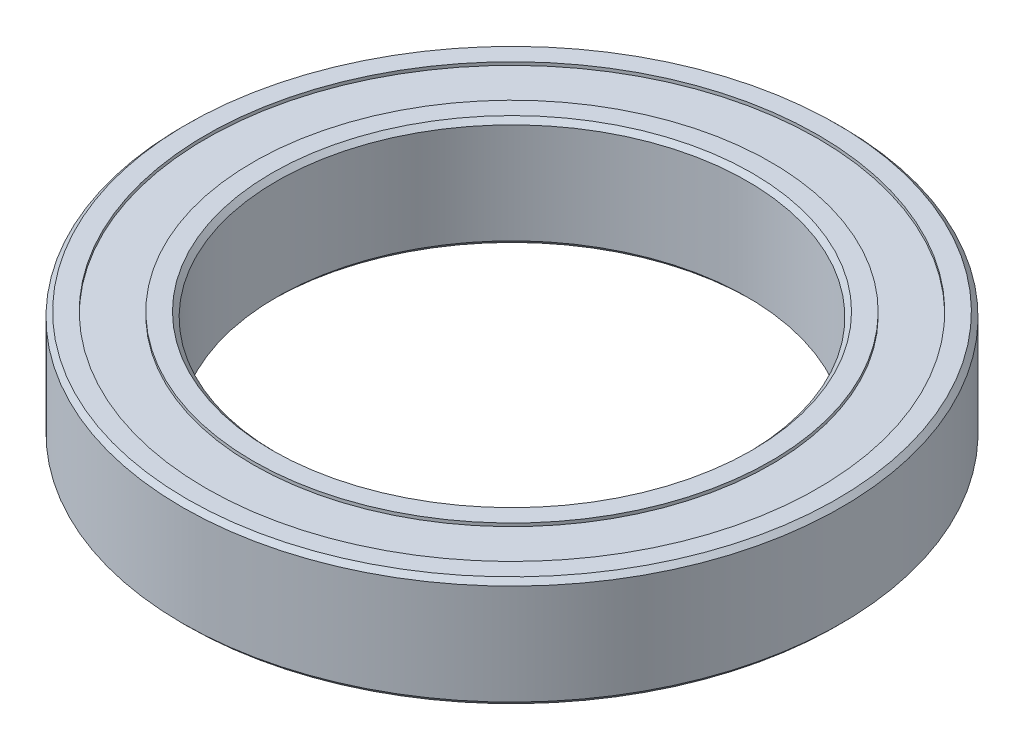
ISO-10303-21;
HEADER;
FILE_DESCRIPTION(('STEP AP214'),'2;1');
FILE_NAME('part.step','',(''),(''),'','','');
FILE_SCHEMA(('AUTOMOTIVE_DESIGN { 1 0 10303 214 1 1 1 1 }'));
ENDSEC;
DATA;
#1=APPLICATION_CONTEXT('core data for automotive mechanical design processes');
#2=APPLICATION_PROTOCOL_DEFINITION('international standard','automotive_design',2000,#1);
#3=PRODUCT_CONTEXT('',#1,'mechanical');
#4=PRODUCT('Part','Part','',(#3));
#5=PRODUCT_RELATED_PRODUCT_CATEGORY('part','',(#4));
#6=PRODUCT_DEFINITION_FORMATION('','',#4);
#7=PRODUCT_DEFINITION_CONTEXT('part definition',#1,'design');
#8=PRODUCT_DEFINITION('design','',#6,#7);
#9=PRODUCT_DEFINITION_SHAPE('','',#8);
#10=(LENGTH_UNIT() NAMED_UNIT(*) SI_UNIT(.MILLI.,.METRE.));
#11=(NAMED_UNIT(*) PLANE_ANGLE_UNIT() SI_UNIT($,.RADIAN.));
#12=(NAMED_UNIT(*) SI_UNIT($,.STERADIAN.) SOLID_ANGLE_UNIT());
#13=UNCERTAINTY_MEASURE_WITH_UNIT(LENGTH_MEASURE(1.E-05),#10,'distance_accuracy_value','');
#14=(GEOMETRIC_REPRESENTATION_CONTEXT(3) GLOBAL_UNCERTAINTY_ASSIGNED_CONTEXT((#13)) GLOBAL_UNIT_ASSIGNED_CONTEXT((#10,
#11,#12)) REPRESENTATION_CONTEXT('',''));
#15=CARTESIAN_POINT('',(0.,0.,0.));
#16=DIRECTION('',(0.,0.,1.));
#17=DIRECTION('',(1.,0.,0.));
#18=AXIS2_PLACEMENT_3D('',#15,#16,#17);
#19=CARTESIAN_POINT('',(0.,0.,0.));
#20=DIRECTION('',(0.,1.,0.));
#21=DIRECTION('',(0.,0.,1.));
#22=AXIS2_PLACEMENT_3D('',#19,#20,#21);
#23=PLANE('',#22);
#24=CARTESIAN_POINT('',(0.,0.,0.));
#25=DIRECTION('',(0.,1.,0.));
#26=DIRECTION('',(0.,0.,1.));
#27=AXIS2_PLACEMENT_3D('',#24,#25,#26);
#28=CIRCLE('',#27,15.3);
#29=CARTESIAN_POINT('',(0.,0.,15.3));
#30=VERTEX_POINT('',#29);
#31=EDGE_CURVE('E66',#30,#30,#28,.T.);
#32=ORIENTED_EDGE('',*,*,#31,.T.);
#33=EDGE_LOOP('',(#32));
#34=FACE_BOUND('',#33,.T.);
#35=CARTESIAN_POINT('',(0.,0.,0.));
#36=DIRECTION('',(0.,-1.,0.));
#37=DIRECTION('',(0.,0.,-1.));
#38=AXIS2_PLACEMENT_3D('',#35,#36,#37);
#39=CIRCLE('',#38,16.5);
#40=CARTESIAN_POINT('',(0.,0.,-16.5));
#41=VERTEX_POINT('',#40);
#42=EDGE_CURVE('E100',#41,#41,#39,.T.);
#43=ORIENTED_EDGE('',*,*,#42,.T.);
#44=EDGE_LOOP('',(#43));
#45=FACE_BOUND('',#44,.T.);
#46=ADVANCED_FACE('F44',(#34,#45),#23,.F.);
#47=CARTESIAN_POINT('',(0.,7.,0.));
#48=DIRECTION('',(0.,1.,0.));
#49=DIRECTION('',(0.,0.,1.));
#50=AXIS2_PLACEMENT_3D('',#47,#48,#49);
#51=PLANE('',#50);
#52=CARTESIAN_POINT('',(0.,7.,0.));
#53=DIRECTION('',(0.,1.,0.));
#54=DIRECTION('',(0.,0.,1.));
#55=AXIS2_PLACEMENT_3D('',#52,#53,#54);
#56=CIRCLE('',#55,15.3);
#57=CARTESIAN_POINT('',(0.,7.,15.3));
#58=VERTEX_POINT('',#57);
#59=EDGE_CURVE('E10',#58,#58,#56,.F.);
#60=ORIENTED_EDGE('',*,*,#59,.T.);
#61=EDGE_LOOP('',(#60));
#62=FACE_BOUND('',#61,.T.);
#63=CARTESIAN_POINT('',(0.,7.,0.));
#64=DIRECTION('',(0.,1.,0.));
#65=DIRECTION('',(0.,0.,1.));
#66=AXIS2_PLACEMENT_3D('',#63,#64,#65);
#67=CIRCLE('',#66,16.5);
#68=CARTESIAN_POINT('',(0.,7.,16.5));
#69=VERTEX_POINT('',#68);
#70=EDGE_CURVE('E83',#69,#69,#67,.T.);
#71=ORIENTED_EDGE('',*,*,#70,.T.);
#72=EDGE_LOOP('',(#71));
#73=FACE_BOUND('',#72,.T.);
#74=ADVANCED_FACE('F146',(#62,#73),#51,.T.);
#75=CARTESIAN_POINT('',(0.,7.,0.));
#76=DIRECTION('',(0.,1.,0.));
#77=DIRECTION('',(0.,0.,1.));
#78=AXIS2_PLACEMENT_3D('',#75,#76,#77);
#79=CIRCLE('',#78,20.7);
#80=CARTESIAN_POINT('',(0.,7.,20.7));
#81=VERTEX_POINT('',#80);
#82=EDGE_CURVE('E61',#81,#81,#79,.T.);
#83=ORIENTED_EDGE('',*,*,#82,.T.);
#84=EDGE_LOOP('',(#83));
#85=FACE_BOUND('',#84,.T.);
#86=CARTESIAN_POINT('',(0.,7.,0.));
#87=DIRECTION('',(0.,1.,0.));
#88=DIRECTION('',(0.,0.,1.));
#89=AXIS2_PLACEMENT_3D('',#86,#87,#88);
#90=CIRCLE('',#89,19.5);
#91=CARTESIAN_POINT('',(0.,7.,19.5));
#92=VERTEX_POINT('',#91);
#93=EDGE_CURVE('E78',#92,#92,#90,.T.);
#94=ORIENTED_EDGE('',*,*,#93,.F.);
#95=EDGE_LOOP('',(#94));
#96=FACE_BOUND('',#95,.T.);
#97=ADVANCED_FACE('F125',(#85,#96),#51,.T.);
#98=CARTESIAN_POINT('',(0.,0.,0.));
#99=DIRECTION('',(0.,-1.,0.));
#100=DIRECTION('',(0.,0.,-1.));
#101=AXIS2_PLACEMENT_3D('',#98,#99,#100);
#102=CIRCLE('',#101,19.5);
#103=CARTESIAN_POINT('',(0.,0.,-19.5));
#104=VERTEX_POINT('',#103);
#105=EDGE_CURVE('E93',#104,#104,#102,.T.);
#106=ORIENTED_EDGE('',*,*,#105,.F.);
#107=EDGE_LOOP('',(#106));
#108=FACE_BOUND('',#107,.T.);
#109=CARTESIAN_POINT('',(0.,0.,0.));
#110=DIRECTION('',(0.,1.,0.));
#111=DIRECTION('',(0.,0.,1.));
#112=AXIS2_PLACEMENT_3D('',#109,#110,#111);
#113=CIRCLE('',#112,20.7);
#114=CARTESIAN_POINT('',(0.,0.,20.7));
#115=VERTEX_POINT('',#114);
#116=EDGE_CURVE('E67',#115,#115,#113,.F.);
#117=ORIENTED_EDGE('',*,*,#116,.T.);
#118=EDGE_LOOP('',(#117));
#119=FACE_BOUND('',#118,.T.);
#120=ADVANCED_FACE('F117',(#108,#119),#23,.F.);
#121=CARTESIAN_POINT('',(0.,7.,0.));
#122=DIRECTION('',(0.,-1.,0.));
#123=DIRECTION('',(0.,0.,-1.));
#124=AXIS2_PLACEMENT_3D('',#121,#122,#123);
#125=CYLINDRICAL_SURFACE('',#124,21.);
#126=CARTESIAN_POINT('',(0.,0.300000000000002,0.));
#127=DIRECTION('',(0.,1.,0.));
#128=DIRECTION('',(0.,0.,1.));
#129=AXIS2_PLACEMENT_3D('',#126,#127,#128);
#130=CIRCLE('',#129,21.);
#131=CARTESIAN_POINT('',(0.,0.300000000000002,21.));
#132=VERTEX_POINT('',#131);
#133=EDGE_CURVE('E75',#132,#132,#130,.T.);
#134=ORIENTED_EDGE('',*,*,#133,.T.);
#135=EDGE_LOOP('',(#134));
#136=FACE_BOUND('',#135,.T.);
#137=CARTESIAN_POINT('',(0.,6.70000000000001,0.));
#138=DIRECTION('',(0.,1.,0.));
#139=DIRECTION('',(0.,0.,1.));
#140=AXIS2_PLACEMENT_3D('',#137,#138,#139);
#141=CIRCLE('',#140,21.);
#142=CARTESIAN_POINT('',(0.,6.70000000000001,21.));
#143=VERTEX_POINT('',#142);
#144=EDGE_CURVE('E73',#143,#143,#141,.F.);
#145=ORIENTED_EDGE('',*,*,#144,.T.);
#146=EDGE_LOOP('',(#145));
#147=FACE_BOUND('',#146,.T.);
#148=ADVANCED_FACE('F122',(#136,#147),#125,.T.);
#149=CARTESIAN_POINT('',(0.,7.,0.));
#150=DIRECTION('',(0.,-1.,0.));
#151=DIRECTION('',(0.,0.,-1.));
#152=AXIS2_PLACEMENT_3D('',#149,#150,#151);
#153=CYLINDRICAL_SURFACE('',#152,15.);
#154=CARTESIAN_POINT('',(0.,0.300000000000003,0.));
#155=DIRECTION('',(0.,1.,0.));
#156=DIRECTION('',(0.,0.,1.));
#157=AXIS2_PLACEMENT_3D('',#154,#155,#156);
#158=CIRCLE('',#157,15.);
#159=CARTESIAN_POINT('',(0.,0.300000000000003,15.));
#160=VERTEX_POINT('',#159);
#161=EDGE_CURVE('E52',#160,#160,#158,.F.);
#162=ORIENTED_EDGE('',*,*,#161,.T.);
#163=EDGE_LOOP('',(#162));
#164=FACE_BOUND('',#163,.T.);
#165=CARTESIAN_POINT('',(0.,6.70000000000002,0.));
#166=DIRECTION('',(0.,1.,0.));
#167=DIRECTION('',(0.,0.,1.));
#168=AXIS2_PLACEMENT_3D('',#165,#166,#167);
#169=CIRCLE('',#168,15.);
#170=CARTESIAN_POINT('',(0.,6.70000000000002,15.));
#171=VERTEX_POINT('',#170);
#172=EDGE_CURVE('E60',#171,#171,#169,.T.);
#173=ORIENTED_EDGE('',*,*,#172,.T.);
#174=EDGE_LOOP('',(#173));
#175=FACE_BOUND('',#174,.T.);
#176=ADVANCED_FACE('F137',(#164,#175),#153,.F.);
#177=CARTESIAN_POINT('',(0.,6.8,0.));
#178=DIRECTION('',(0.,1.,0.));
#179=DIRECTION('',(0.,0.,1.));
#180=AXIS2_PLACEMENT_3D('',#177,#178,#179);
#181=CYLINDRICAL_SURFACE('',#180,19.5);
#182=CARTESIAN_POINT('',(0.,6.8,0.));
#183=DIRECTION('',(0.,1.,0.));
#184=DIRECTION('',(0.,0.,1.));
#185=AXIS2_PLACEMENT_3D('',#182,#183,#184);
#186=CIRCLE('',#185,19.5);
#187=CARTESIAN_POINT('',(0.,6.8,19.5));
#188=VERTEX_POINT('',#187);
#189=EDGE_CURVE('E77',#188,#188,#186,.T.);
#190=ORIENTED_EDGE('',*,*,#189,.F.);
#191=EDGE_LOOP('',(#190));
#192=FACE_BOUND('',#191,.T.);
#193=ORIENTED_EDGE('',*,*,#93,.T.);
#194=EDGE_LOOP('',(#193));
#195=FACE_BOUND('',#194,.T.);
#196=ADVANCED_FACE('F155',(#192,#195),#181,.F.);
#197=CARTESIAN_POINT('',(0.,6.8,0.));
#198=DIRECTION('',(0.,1.,0.));
#199=DIRECTION('',(0.,0.,1.));
#200=AXIS2_PLACEMENT_3D('',#197,#198,#199);
#201=PLANE('',#200);
#202=CARTESIAN_POINT('',(0.,6.8,0.));
#203=DIRECTION('',(0.,1.,0.));
#204=DIRECTION('',(0.,0.,1.));
#205=AXIS2_PLACEMENT_3D('',#202,#203,#204);
#206=CIRCLE('',#205,16.5);
#207=CARTESIAN_POINT('',(0.,6.8,16.5));
#208=VERTEX_POINT('',#207);
#209=EDGE_CURVE('E85',#208,#208,#206,.T.);
#210=ORIENTED_EDGE('',*,*,#209,.F.);
#211=EDGE_LOOP('',(#210));
#212=FACE_BOUND('',#211,.T.);
#213=ORIENTED_EDGE('',*,*,#189,.T.);
#214=EDGE_LOOP('',(#213));
#215=FACE_BOUND('',#214,.T.);
#216=ADVANCED_FACE('F152',(#212,#215),#201,.T.);
#217=CARTESIAN_POINT('',(0.,6.8,0.));
#218=DIRECTION('',(0.,1.,0.));
#219=DIRECTION('',(0.,0.,1.));
#220=AXIS2_PLACEMENT_3D('',#217,#218,#219);
#221=CYLINDRICAL_SURFACE('',#220,16.5);
#222=ORIENTED_EDGE('',*,*,#209,.T.);
#223=EDGE_LOOP('',(#222));
#224=FACE_BOUND('',#223,.T.);
#225=ORIENTED_EDGE('',*,*,#70,.F.);
#226=EDGE_LOOP('',(#225));
#227=FACE_BOUND('',#226,.T.);
#228=ADVANCED_FACE('F128',(#224,#227),#221,.T.);
#229=CARTESIAN_POINT('',(0.,0.300000000000002,0.));
#230=DIRECTION('',(0.,1.,0.));
#231=DIRECTION('',(0.,0.,1.));
#232=AXIS2_PLACEMENT_3D('',#229,#230,#231);
#233=CONICAL_SURFACE('',#232,21.,0.785398163397454);
#234=ORIENTED_EDGE('',*,*,#116,.F.);
#235=EDGE_LOOP('',(#234));
#236=FACE_BOUND('',#235,.T.);
#237=ORIENTED_EDGE('',*,*,#133,.F.);
#238=EDGE_LOOP('',(#237));
#239=FACE_BOUND('',#238,.T.);
#240=ADVANCED_FACE('F127',(#236,#239),#233,.T.);
#241=CARTESIAN_POINT('',(0.,7.,0.));
#242=DIRECTION('',(0.,-1.,0.));
#243=DIRECTION('',(0.,0.,-1.));
#244=AXIS2_PLACEMENT_3D('',#241,#242,#243);
#245=CONICAL_SURFACE('',#244,20.7,0.785398163397466);
#246=ORIENTED_EDGE('',*,*,#144,.F.);
#247=EDGE_LOOP('',(#246));
#248=FACE_BOUND('',#247,.T.);
#249=ORIENTED_EDGE('',*,*,#82,.F.);
#250=EDGE_LOOP('',(#249));
#251=FACE_BOUND('',#250,.T.);
#252=ADVANCED_FACE('F129',(#248,#251),#245,.T.);
#253=CARTESIAN_POINT('',(0.,0.,0.));
#254=DIRECTION('',(0.,-1.,0.));
#255=DIRECTION('',(0.,0.,-1.));
#256=AXIS2_PLACEMENT_3D('',#253,#254,#255);
#257=CONICAL_SURFACE('',#256,15.3,0.785398163397445);
#258=ORIENTED_EDGE('',*,*,#161,.F.);
#259=EDGE_LOOP('',(#258));
#260=FACE_BOUND('',#259,.T.);
#261=ORIENTED_EDGE('',*,*,#31,.F.);
#262=EDGE_LOOP('',(#261));
#263=FACE_BOUND('',#262,.T.);
#264=ADVANCED_FACE('F142',(#260,#263),#257,.F.);
#265=CARTESIAN_POINT('',(0.,6.70000000000002,0.));
#266=DIRECTION('',(0.,1.,0.));
#267=DIRECTION('',(0.,0.,1.));
#268=AXIS2_PLACEMENT_3D('',#265,#266,#267);
#269=CONICAL_SURFACE('',#268,15.,0.785398163397463);
#270=ORIENTED_EDGE('',*,*,#59,.F.);
#271=EDGE_LOOP('',(#270));
#272=FACE_BOUND('',#271,.T.);
#273=ORIENTED_EDGE('',*,*,#172,.F.);
#274=EDGE_LOOP('',(#273));
#275=FACE_BOUND('',#274,.T.);
#276=ADVANCED_FACE('F48',(#272,#275),#269,.F.);
#277=CARTESIAN_POINT('',(0.,0.2,0.));
#278=DIRECTION('',(0.,-1.,0.));
#279=DIRECTION('',(0.,0.,-1.));
#280=AXIS2_PLACEMENT_3D('',#277,#278,#279);
#281=CYLINDRICAL_SURFACE('',#280,19.5);
#282=CARTESIAN_POINT('',(0.,0.2,0.));
#283=DIRECTION('',(0.,-1.,0.));
#284=DIRECTION('',(0.,0.,-1.));
#285=AXIS2_PLACEMENT_3D('',#282,#283,#284);
#286=CIRCLE('',#285,19.5);
#287=CARTESIAN_POINT('',(0.,0.2,-19.5));
#288=VERTEX_POINT('',#287);
#289=EDGE_CURVE('E86',#288,#288,#286,.T.);
#290=ORIENTED_EDGE('',*,*,#289,.F.);
#291=EDGE_LOOP('',(#290));
#292=FACE_BOUND('',#291,.T.);
#293=ORIENTED_EDGE('',*,*,#105,.T.);
#294=EDGE_LOOP('',(#293));
#295=FACE_BOUND('',#294,.T.);
#296=ADVANCED_FACE('F108',(#292,#295),#281,.F.);
#297=CARTESIAN_POINT('',(0.,0.2,0.));
#298=DIRECTION('',(0.,-1.,0.));
#299=DIRECTION('',(0.,0.,-1.));
#300=AXIS2_PLACEMENT_3D('',#297,#298,#299);
#301=PLANE('',#300);
#302=CARTESIAN_POINT('',(0.,0.2,0.));
#303=DIRECTION('',(0.,-1.,0.));
#304=DIRECTION('',(0.,0.,-1.));
#305=AXIS2_PLACEMENT_3D('',#302,#303,#304);
#306=CIRCLE('',#305,16.5);
#307=CARTESIAN_POINT('',(0.,0.2,-16.5));
#308=VERTEX_POINT('',#307);
#309=EDGE_CURVE('E94',#308,#308,#306,.T.);
#310=ORIENTED_EDGE('',*,*,#309,.F.);
#311=EDGE_LOOP('',(#310));
#312=FACE_BOUND('',#311,.T.);
#313=ORIENTED_EDGE('',*,*,#289,.T.);
#314=EDGE_LOOP('',(#313));
#315=FACE_BOUND('',#314,.T.);
#316=ADVANCED_FACE('F106',(#312,#315),#301,.T.);
#317=CARTESIAN_POINT('',(0.,0.2,0.));
#318=DIRECTION('',(0.,-1.,0.));
#319=DIRECTION('',(0.,0.,-1.));
#320=AXIS2_PLACEMENT_3D('',#317,#318,#319);
#321=CYLINDRICAL_SURFACE('',#320,16.5);
#322=ORIENTED_EDGE('',*,*,#309,.T.);
#323=EDGE_LOOP('',(#322));
#324=FACE_BOUND('',#323,.T.);
#325=ORIENTED_EDGE('',*,*,#42,.F.);
#326=EDGE_LOOP('',(#325));
#327=FACE_BOUND('',#326,.T.);
#328=ADVANCED_FACE('F103',(#324,#327),#321,.T.);
#329=CLOSED_SHELL('',(#46,#74,#97,#120,#148,#176,#196,#216,#228,#240,#252,#264,#276,#296,#316,#328));
#330=MANIFOLD_SOLID_BREP('B2',#329);
#331=ADVANCED_BREP_SHAPE_REPRESENTATION('',(#18,#330),#14);
#332=SHAPE_DEFINITION_REPRESENTATION(#9,#331);
ENDSEC;
END-ISO-10303-21;
